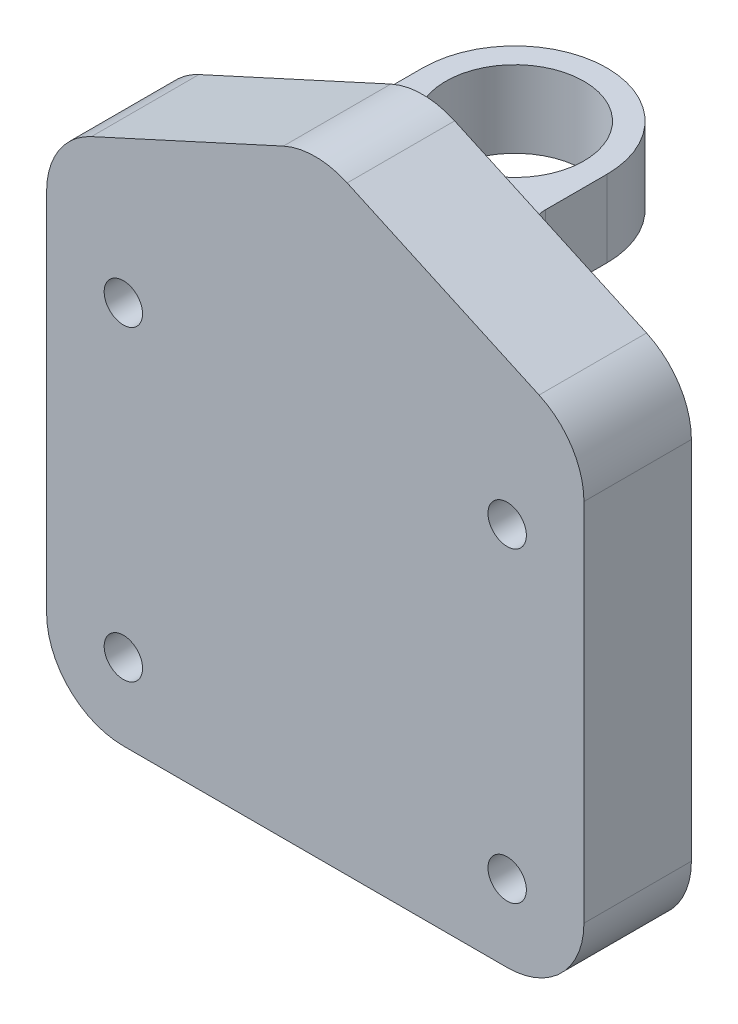
ISO-10303-21;
HEADER;
FILE_DESCRIPTION(('STEP AP214'),'2;1');
FILE_NAME('part.step','',(''),(''),'','','');
FILE_SCHEMA(('AUTOMOTIVE_DESIGN { 1 0 10303 214 1 1 1 1 }'));
ENDSEC;
DATA;
#1=APPLICATION_CONTEXT('core data for automotive mechanical design processes');
#2=APPLICATION_PROTOCOL_DEFINITION('international standard','automotive_design',2000,#1);
#3=PRODUCT_CONTEXT('',#1,'mechanical');
#4=PRODUCT('Part','Part','',(#3));
#5=PRODUCT_RELATED_PRODUCT_CATEGORY('part','',(#4));
#6=PRODUCT_DEFINITION_FORMATION('','',#4);
#7=PRODUCT_DEFINITION_CONTEXT('part definition',#1,'design');
#8=PRODUCT_DEFINITION('design','',#6,#7);
#9=PRODUCT_DEFINITION_SHAPE('','',#8);
#10=(LENGTH_UNIT() NAMED_UNIT(*) SI_UNIT(.MILLI.,.METRE.));
#11=(NAMED_UNIT(*) PLANE_ANGLE_UNIT() SI_UNIT($,.RADIAN.));
#12=(NAMED_UNIT(*) SI_UNIT($,.STERADIAN.) SOLID_ANGLE_UNIT());
#13=UNCERTAINTY_MEASURE_WITH_UNIT(LENGTH_MEASURE(1.E-05),#10,'distance_accuracy_value','');
#14=(GEOMETRIC_REPRESENTATION_CONTEXT(3) GLOBAL_UNCERTAINTY_ASSIGNED_CONTEXT((#13)) GLOBAL_UNIT_ASSIGNED_CONTEXT((#10,
#11,#12)) REPRESENTATION_CONTEXT('',''));
#15=CARTESIAN_POINT('',(0.,0.,0.));
#16=DIRECTION('',(0.,0.,1.));
#17=DIRECTION('',(1.,0.,0.));
#18=AXIS2_PLACEMENT_3D('',#15,#16,#17);
#19=CARTESIAN_POINT('',(0.,-9.05756915921913E-12,217.634763614724));
#20=DIRECTION('',(0.,0.,-1.));
#21=DIRECTION('',(0.,1.,0.));
#22=AXIS2_PLACEMENT_3D('',#19,#20,#21);
#23=PLANE('',#22);
#24=CARTESIAN_POINT('',(12.5000000000011,-685.255568978379,217.634763614696));
#25=DIRECTION('',(0.,0.,-1.));
#26=DIRECTION('',(0.,1.,0.));
#27=AXIS2_PLACEMENT_3D('',#24,#25,#26);
#28=CIRCLE('',#27,1.25000000000002);
#29=CARTESIAN_POINT('',(12.5000000000011,-684.005568978379,217.634763614696));
#30=VERTEX_POINT('',#29);
#31=EDGE_CURVE('E261',#30,#30,#28,.T.);
#32=ORIENTED_EDGE('',*,*,#31,.F.);
#33=EDGE_LOOP('',(#32));
#34=FACE_BOUND('',#33,.T.);
#35=CARTESIAN_POINT('',(-12.499999999999,-665.255568978379,217.634763614697));
#36=DIRECTION('',(0.,0.,-1.));
#37=DIRECTION('',(0.,1.,0.));
#38=AXIS2_PLACEMENT_3D('',#35,#36,#37);
#39=CIRCLE('',#38,1.25000000000002);
#40=CARTESIAN_POINT('',(-12.499999999999,-664.005568978379,217.634763614697));
#41=VERTEX_POINT('',#40);
#42=EDGE_CURVE('E273',#41,#41,#39,.T.);
#43=ORIENTED_EDGE('',*,*,#42,.F.);
#44=EDGE_LOOP('',(#43));
#45=FACE_BOUND('',#44,.T.);
#46=CARTESIAN_POINT('',(12.500000000001,-665.255568978379,217.634763614697));
#47=DIRECTION('',(0.,0.,-1.));
#48=DIRECTION('',(0.,1.,0.));
#49=AXIS2_PLACEMENT_3D('',#46,#47,#48);
#50=CIRCLE('',#49,1.25000000000002);
#51=CARTESIAN_POINT('',(12.500000000001,-664.005568978379,217.634763614697));
#52=VERTEX_POINT('',#51);
#53=EDGE_CURVE('E267',#52,#52,#50,.T.);
#54=ORIENTED_EDGE('',*,*,#53,.F.);
#55=EDGE_LOOP('',(#54));
#56=FACE_BOUND('',#55,.T.);
#57=CARTESIAN_POINT('',(-12.4999999999989,-685.255568978379,217.634763614696));
#58=DIRECTION('',(0.,0.,-1.));
#59=DIRECTION('',(0.,1.,0.));
#60=AXIS2_PLACEMENT_3D('',#57,#58,#59);
#61=CIRCLE('',#60,1.24999999999999);
#62=CARTESIAN_POINT('',(-12.4999999999989,-684.005568978379,217.634763614696));
#63=VERTEX_POINT('',#62);
#64=EDGE_CURVE('E255',#63,#63,#61,.T.);
#65=ORIENTED_EDGE('',*,*,#64,.F.);
#66=EDGE_LOOP('',(#65));
#67=FACE_BOUND('',#66,.T.);
#68=DIRECTION('',(-1.,0.,0.));
#69=VECTOR('',#68,1.);
#70=CARTESIAN_POINT('',(6.00000000000137,-655.255568978379,217.634763614697));
#71=LINE('',#70,#69);
#72=CARTESIAN_POINT('',(8.00000000000138,-655.255568978379,217.634763614697));
#73=VERTEX_POINT('',#72);
#74=CARTESIAN_POINT('',(-7.99999999999862,-655.255568978379,217.634763614697));
#75=VERTEX_POINT('',#74);
#76=EDGE_CURVE('E244',#73,#75,#71,.T.);
#77=ORIENTED_EDGE('',*,*,#76,.T.);
#78=DIRECTION('',(0.,1.,0.));
#79=VECTOR('',#78,1.);
#80=CARTESIAN_POINT('',(-8.0000000000007,-9.08294568549627E-12,217.634763614724));
#81=LINE('',#80,#79);
#82=CARTESIAN_POINT('',(-7.99999999999861,-660.255568978379,217.634763614697));
#83=VERTEX_POINT('',#82);
#84=EDGE_CURVE('E315',#75,#83,#81,.F.);
#85=ORIENTED_EDGE('',*,*,#84,.T.);
#86=DIRECTION('',(-1.,0.,0.));
#87=VECTOR('',#86,1.);
#88=CARTESIAN_POINT('',(6.00000000000138,-660.255568978379,217.634763614697));
#89=LINE('',#88,#87);
#90=CARTESIAN_POINT('',(8.00000000000139,-660.255568978379,217.634763614697));
#91=VERTEX_POINT('',#90);
#92=EDGE_CURVE('E234',#91,#83,#89,.T.);
#93=ORIENTED_EDGE('',*,*,#92,.F.);
#94=DIRECTION('',(0.,1.,0.));
#95=VECTOR('',#94,1.);
#96=CARTESIAN_POINT('',(7.9999999999993,-9.03219263294198E-12,217.634763614724));
#97=LINE('',#96,#95);
#98=EDGE_CURVE('E312',#91,#73,#97,.T.);
#99=ORIENTED_EDGE('',*,*,#98,.T.);
#100=EDGE_LOOP('',(#77,#85,#93,#99));
#101=FACE_BOUND('',#100,.T.);
#102=DIRECTION('',(-1.,0.,0.));
#103=VECTOR('',#102,1.);
#104=CARTESIAN_POINT('',(17.5000000000011,-690.255568978379,217.634763614696));
#105=LINE('',#104,#103);
#106=CARTESIAN_POINT('',(-7.99999999999851,-690.255568978379,217.634763614696));
#107=VERTEX_POINT('',#106);
#108=CARTESIAN_POINT('',(-12.4999999999989,-690.255568978379,217.634763614696));
#109=VERTEX_POINT('',#108);
#110=EDGE_CURVE('E282',#107,#109,#105,.T.);
#111=ORIENTED_EDGE('',*,*,#110,.T.);
#112=CARTESIAN_POINT('',(-12.4999999999989,-685.255568978379,217.634763614696));
#113=DIRECTION('',(0.,0.,-1.));
#114=DIRECTION('',(0.,1.,0.));
#115=AXIS2_PLACEMENT_3D('',#112,#113,#114);
#116=CIRCLE('',#115,5.);
#117=CARTESIAN_POINT('',(-17.4999999999989,-685.255568978379,217.634763614696));
#118=VERTEX_POINT('',#117);
#119=EDGE_CURVE('E370',#109,#118,#116,.T.);
#120=ORIENTED_EDGE('',*,*,#119,.T.);
#121=DIRECTION('',(0.,1.,0.));
#122=VECTOR('',#121,1.);
#123=CARTESIAN_POINT('',(-17.4999999999989,-690.255568978379,217.634763614696));
#124=LINE('',#123,#122);
#125=CARTESIAN_POINT('',(-17.499999999999,-661.467535094063,217.634763614697));
#126=VERTEX_POINT('',#125);
#127=EDGE_CURVE('E281',#118,#126,#124,.T.);
#128=ORIENTED_EDGE('',*,*,#127,.T.);
#129=CARTESIAN_POINT('',(-12.499999999999,-661.467535094063,217.634763614697));
#130=DIRECTION('',(0.,0.,-1.));
#131=DIRECTION('',(0.,1.,0.));
#132=AXIS2_PLACEMENT_3D('',#129,#130,#131);
#133=CIRCLE('',#132,5.);
#134=CARTESIAN_POINT('',(-14.5787988013381,-656.920162716134,217.634763614697));
#135=VERTEX_POINT('',#134);
#136=EDGE_CURVE('E363',#126,#135,#133,.T.);
#137=ORIENTED_EDGE('',*,*,#136,.T.);
#138=DIRECTION('',(0.9094744755858,0.415759760267795,0.));
#139=VECTOR('',#138,1.);
#140=CARTESIAN_POINT('',(9.16097855664178E-13,-650.255568978379,217.634763614697));
#141=LINE('',#140,#139);
#142=CARTESIAN_POINT('',(-2.07879880133798,-651.205877001848,217.634763614697));
#143=VERTEX_POINT('',#142);
#144=EDGE_CURVE('E285',#135,#143,#141,.T.);
#145=ORIENTED_EDGE('',*,*,#144,.T.);
#146=CARTESIAN_POINT('',(9.47159017883337E-13,-655.753249379777,217.634763614697));
#147=DIRECTION('',(0.,0.,-1.));
#148=DIRECTION('',(0.,1.,0.));
#149=AXIS2_PLACEMENT_3D('',#146,#147,#148);
#150=CIRCLE('',#149,5.);
#151=CARTESIAN_POINT('',(2.07879880133987,-651.205877001848,217.634763614697));
#152=VERTEX_POINT('',#151);
#153=EDGE_CURVE('E365',#143,#152,#150,.T.);
#154=ORIENTED_EDGE('',*,*,#153,.T.);
#155=DIRECTION('',(0.909474475585802,-0.415759760267789,0.));
#156=VECTOR('',#155,1.);
#157=CARTESIAN_POINT('',(17.5000000000009,-658.255568978379,217.634763614697));
#158=LINE('',#157,#156);
#159=CARTESIAN_POINT('',(14.5787988013399,-656.920162716134,217.634763614697));
#160=VERTEX_POINT('',#159);
#161=EDGE_CURVE('E288',#152,#160,#158,.T.);
#162=ORIENTED_EDGE('',*,*,#161,.T.);
#163=CARTESIAN_POINT('',(12.500000000001,-661.467535094063,217.634763614697));
#164=DIRECTION('',(0.,0.,-1.));
#165=DIRECTION('',(0.,1.,0.));
#166=AXIS2_PLACEMENT_3D('',#163,#164,#165);
#167=CIRCLE('',#166,5.);
#168=CARTESIAN_POINT('',(17.500000000001,-661.467535094063,217.634763614697));
#169=VERTEX_POINT('',#168);
#170=EDGE_CURVE('E55',#160,#169,#167,.T.);
#171=ORIENTED_EDGE('',*,*,#170,.T.);
#172=DIRECTION('',(0.,-1.,0.));
#173=VECTOR('',#172,1.);
#174=CARTESIAN_POINT('',(17.5000000000011,-690.255568978379,217.634763614696));
#175=LINE('',#174,#173);
#176=CARTESIAN_POINT('',(17.500000000001,-685.255568978379,217.634763614696));
#177=VERTEX_POINT('',#176);
#178=EDGE_CURVE('E290',#169,#177,#175,.T.);
#179=ORIENTED_EDGE('',*,*,#178,.T.);
#180=CARTESIAN_POINT('',(12.500000000001,-685.255568978379,217.634763614696));
#181=DIRECTION('',(0.,0.,-1.));
#182=DIRECTION('',(0.,1.,0.));
#183=AXIS2_PLACEMENT_3D('',#180,#181,#182);
#184=CIRCLE('',#183,5.);
#185=CARTESIAN_POINT('',(12.5000000000011,-690.255568978379,217.634763614696));
#186=VERTEX_POINT('',#185);
#187=EDGE_CURVE('E368',#177,#186,#184,.T.);
#188=ORIENTED_EDGE('',*,*,#187,.T.);
#189=CARTESIAN_POINT('',(8.00000000000149,-690.255568978379,217.634763614696));
#190=VERTEX_POINT('',#189);
#191=EDGE_CURVE('E279',#186,#190,#105,.T.);
#192=ORIENTED_EDGE('',*,*,#191,.T.);
#193=DIRECTION('',(0.,1.,0.));
#194=VECTOR('',#193,1.);
#195=CARTESIAN_POINT('',(7.9999999999993,-9.03219263294198E-12,217.634763614724));
#196=LINE('',#195,#194);
#197=CARTESIAN_POINT('',(8.00000000000147,-685.255568978379,217.634763614696));
#198=VERTEX_POINT('',#197);
#199=EDGE_CURVE('E309',#190,#198,#196,.T.);
#200=ORIENTED_EDGE('',*,*,#199,.T.);
#201=DIRECTION('',(-1.,0.,0.));
#202=VECTOR('',#201,1.);
#203=CARTESIAN_POINT('',(6.00000000000146,-685.255568978379,217.634763614696));
#204=LINE('',#203,#202);
#205=CARTESIAN_POINT('',(-7.99999999999853,-685.255568978379,217.634763614696));
#206=VERTEX_POINT('',#205);
#207=EDGE_CURVE('E219',#198,#206,#204,.T.);
#208=ORIENTED_EDGE('',*,*,#207,.T.);
#209=DIRECTION('',(0.,1.,0.));
#210=VECTOR('',#209,1.);
#211=CARTESIAN_POINT('',(-8.0000000000007,-9.08294568549627E-12,217.634763614724));
#212=LINE('',#211,#210);
#213=EDGE_CURVE('E307',#206,#107,#212,.F.);
#214=ORIENTED_EDGE('',*,*,#213,.T.);
#215=EDGE_LOOP('',(#111,#120,#128,#137,#145,#154,#162,#171,#179,#188,#192,#200,#208,#214));
#216=FACE_BOUND('',#215,.T.);
#217=ADVANCED_FACE('F33',(#34,#45,#56,#67,#101,#216),#23,.T.);
#218=CARTESIAN_POINT('',(0.,-9.3523007511111E-12,224.634763614724));
#219=DIRECTION('',(0.,0.,-1.));
#220=DIRECTION('',(0.,1.,0.));
#221=AXIS2_PLACEMENT_3D('',#218,#219,#220);
#222=PLANE('',#221);
#223=DIRECTION('',(0.,1.,0.));
#224=VECTOR('',#223,1.);
#225=CARTESIAN_POINT('',(-17.4999999999989,-690.255568978379,224.634763614696));
#226=LINE('',#225,#224);
#227=CARTESIAN_POINT('',(-17.4999999999989,-685.255568978379,224.634763614696));
#228=VERTEX_POINT('',#227);
#229=CARTESIAN_POINT('',(-17.499999999999,-661.467535094063,224.634763614697));
#230=VERTEX_POINT('',#229);
#231=EDGE_CURVE('E294',#228,#230,#226,.T.);
#232=ORIENTED_EDGE('',*,*,#231,.F.);
#233=CARTESIAN_POINT('',(-12.4999999999989,-685.255568978379,224.634763614696));
#234=DIRECTION('',(0.,0.,-1.));
#235=DIRECTION('',(0.,1.,0.));
#236=AXIS2_PLACEMENT_3D('',#233,#234,#235);
#237=CIRCLE('',#236,5.);
#238=CARTESIAN_POINT('',(-12.4999999999989,-690.255568978379,224.634763614696));
#239=VERTEX_POINT('',#238);
#240=EDGE_CURVE('E356',#228,#239,#237,.F.);
#241=ORIENTED_EDGE('',*,*,#240,.T.);
#242=DIRECTION('',(-1.,0.,0.));
#243=VECTOR('',#242,1.);
#244=CARTESIAN_POINT('',(17.5000000000011,-690.255568978379,224.634763614696));
#245=LINE('',#244,#243);
#246=CARTESIAN_POINT('',(12.5000000000011,-690.255568978379,224.634763614696));
#247=VERTEX_POINT('',#246);
#248=EDGE_CURVE('E276',#247,#239,#245,.T.);
#249=ORIENTED_EDGE('',*,*,#248,.F.);
#250=CARTESIAN_POINT('',(12.500000000001,-685.255568978379,224.634763614696));
#251=DIRECTION('',(0.,0.,-1.));
#252=DIRECTION('',(0.,1.,0.));
#253=AXIS2_PLACEMENT_3D('',#250,#251,#252);
#254=CIRCLE('',#253,5.);
#255=CARTESIAN_POINT('',(17.500000000001,-685.255568978379,224.634763614696));
#256=VERTEX_POINT('',#255);
#257=EDGE_CURVE('E354',#247,#256,#254,.F.);
#258=ORIENTED_EDGE('',*,*,#257,.T.);
#259=DIRECTION('',(0.,-1.,0.));
#260=VECTOR('',#259,1.);
#261=CARTESIAN_POINT('',(17.5000000000011,-690.255568978379,224.634763614696));
#262=LINE('',#261,#260);
#263=CARTESIAN_POINT('',(17.500000000001,-661.467535094063,224.634763614697));
#264=VERTEX_POINT('',#263);
#265=EDGE_CURVE('E303',#264,#256,#262,.T.);
#266=ORIENTED_EDGE('',*,*,#265,.F.);
#267=CARTESIAN_POINT('',(12.500000000001,-661.467535094063,224.634763614697));
#268=DIRECTION('',(0.,0.,-1.));
#269=DIRECTION('',(0.,1.,0.));
#270=AXIS2_PLACEMENT_3D('',#267,#268,#269);
#271=CIRCLE('',#270,5.);
#272=CARTESIAN_POINT('',(14.5787988013399,-656.920162716134,224.634763614697));
#273=VERTEX_POINT('',#272);
#274=EDGE_CURVE('E352',#264,#273,#271,.F.);
#275=ORIENTED_EDGE('',*,*,#274,.T.);
#276=DIRECTION('',(0.909474475585802,-0.415759760267789,0.));
#277=VECTOR('',#276,1.);
#278=CARTESIAN_POINT('',(17.5000000000009,-658.255568978379,224.634763614697));
#279=LINE('',#278,#277);
#280=CARTESIAN_POINT('',(2.07879880133987,-651.205877001848,224.634763614697));
#281=VERTEX_POINT('',#280);
#282=EDGE_CURVE('E300',#281,#273,#279,.T.);
#283=ORIENTED_EDGE('',*,*,#282,.F.);
#284=CARTESIAN_POINT('',(9.46576150795408E-13,-655.753249379777,224.634763614697));
#285=DIRECTION('',(0.,0.,-1.));
#286=DIRECTION('',(0.,1.,0.));
#287=AXIS2_PLACEMENT_3D('',#284,#285,#286);
#288=CIRCLE('',#287,5.);
#289=CARTESIAN_POINT('',(-2.07879880133798,-651.205877001848,224.634763614697));
#290=VERTEX_POINT('',#289);
#291=EDGE_CURVE('E350',#281,#290,#288,.F.);
#292=ORIENTED_EDGE('',*,*,#291,.T.);
#293=DIRECTION('',(0.9094744755858,0.415759760267795,0.));
#294=VECTOR('',#293,1.);
#295=CARTESIAN_POINT('',(9.1551498857625E-13,-650.255568978379,224.634763614697));
#296=LINE('',#295,#294);
#297=CARTESIAN_POINT('',(-14.5787988013381,-656.920162716134,224.634763614697));
#298=VERTEX_POINT('',#297);
#299=EDGE_CURVE('E297',#298,#290,#296,.T.);
#300=ORIENTED_EDGE('',*,*,#299,.F.);
#301=CARTESIAN_POINT('',(-12.499999999999,-661.467535094063,224.634763614697));
#302=DIRECTION('',(0.,0.,-1.));
#303=DIRECTION('',(0.,1.,0.));
#304=AXIS2_PLACEMENT_3D('',#301,#302,#303);
#305=CIRCLE('',#304,5.);
#306=EDGE_CURVE('E348',#298,#230,#305,.F.);
#307=ORIENTED_EDGE('',*,*,#306,.T.);
#308=EDGE_LOOP('',(#232,#241,#249,#258,#266,#275,#283,#292,#300,#307));
#309=FACE_BOUND('',#308,.T.);
#310=CARTESIAN_POINT('',(-12.499999999999,-665.255568978379,224.634763614697));
#311=DIRECTION('',(0.,0.,-1.));
#312=DIRECTION('',(0.,1.,0.));
#313=AXIS2_PLACEMENT_3D('',#310,#311,#312);
#314=CIRCLE('',#313,1.25000000000002);
#315=CARTESIAN_POINT('',(-12.499999999999,-664.005568978379,224.634763614697));
#316=VERTEX_POINT('',#315);
#317=EDGE_CURVE('E270',#316,#316,#314,.T.);
#318=ORIENTED_EDGE('',*,*,#317,.T.);
#319=EDGE_LOOP('',(#318));
#320=FACE_BOUND('',#319,.T.);
#321=CARTESIAN_POINT('',(12.500000000001,-665.255568978379,224.634763614697));
#322=DIRECTION('',(0.,0.,-1.));
#323=DIRECTION('',(0.,1.,0.));
#324=AXIS2_PLACEMENT_3D('',#321,#322,#323);
#325=CIRCLE('',#324,1.25000000000002);
#326=CARTESIAN_POINT('',(12.500000000001,-664.005568978379,224.634763614697));
#327=VERTEX_POINT('',#326);
#328=EDGE_CURVE('E264',#327,#327,#325,.T.);
#329=ORIENTED_EDGE('',*,*,#328,.T.);
#330=EDGE_LOOP('',(#329));
#331=FACE_BOUND('',#330,.T.);
#332=CARTESIAN_POINT('',(12.5000000000011,-685.255568978379,224.634763614696));
#333=DIRECTION('',(0.,0.,-1.));
#334=DIRECTION('',(0.,1.,0.));
#335=AXIS2_PLACEMENT_3D('',#332,#333,#334);
#336=CIRCLE('',#335,1.25000000000002);
#337=CARTESIAN_POINT('',(12.5000000000011,-684.005568978379,224.634763614696));
#338=VERTEX_POINT('',#337);
#339=EDGE_CURVE('E258',#338,#338,#336,.T.);
#340=ORIENTED_EDGE('',*,*,#339,.T.);
#341=EDGE_LOOP('',(#340));
#342=FACE_BOUND('',#341,.T.);
#343=CARTESIAN_POINT('',(-12.4999999999989,-685.255568978379,224.634763614696));
#344=DIRECTION('',(0.,0.,-1.));
#345=DIRECTION('',(0.,1.,0.));
#346=AXIS2_PLACEMENT_3D('',#343,#344,#345);
#347=CIRCLE('',#346,1.24999999999999);
#348=CARTESIAN_POINT('',(-12.4999999999989,-684.005568978379,224.634763614696));
#349=VERTEX_POINT('',#348);
#350=EDGE_CURVE('E254',#349,#349,#347,.T.);
#351=ORIENTED_EDGE('',*,*,#350,.T.);
#352=EDGE_LOOP('',(#351));
#353=FACE_BOUND('',#352,.T.);
#354=ADVANCED_FACE('F391',(#309,#320,#331,#342,#353),#222,.F.);
#355=CARTESIAN_POINT('',(17.5000000000011,-690.255568978379,217.634763614696));
#356=DIRECTION('',(0.,1.,0.));
#357=DIRECTION('',(0.,0.,1.));
#358=AXIS2_PLACEMENT_3D('',#355,#356,#357);
#359=PLANE('',#358);
#360=ORIENTED_EDGE('',*,*,#248,.T.);
#361=DIRECTION('',(0.,0.,1.));
#362=VECTOR('',#361,1.);
#363=CARTESIAN_POINT('',(-12.4999999999989,-690.255568978379,217.634763614696));
#364=LINE('',#363,#362);
#365=EDGE_CURVE('E361',#239,#109,#364,.F.);
#366=ORIENTED_EDGE('',*,*,#365,.T.);
#367=ORIENTED_EDGE('',*,*,#110,.F.);
#368=CARTESIAN_POINT('',(-7.99999999999851,-690.255568978379,215.634763614696));
#369=DIRECTION('',(0.,1.,0.));
#370=DIRECTION('',(0.,0.,1.));
#371=AXIS2_PLACEMENT_3D('',#368,#369,#370);
#372=CIRCLE('',#371,2.);
#373=CARTESIAN_POINT('',(-5.99999999999851,-690.255568978379,215.634763614696));
#374=VERTEX_POINT('',#373);
#375=EDGE_CURVE('E193',#107,#374,#372,.T.);
#376=ORIENTED_EDGE('',*,*,#375,.T.);
#377=DIRECTION('',(0.,0.,-1.));
#378=VECTOR('',#377,1.);
#379=CARTESIAN_POINT('',(-5.99999999999852,-690.255568978379,217.634763614695));
#380=LINE('',#379,#378);
#381=CARTESIAN_POINT('',(-5.9999999999985,-690.255568978378,211.634763614695));
#382=VERTEX_POINT('',#381);
#383=EDGE_CURVE('E182',#374,#382,#380,.T.);
#384=ORIENTED_EDGE('',*,*,#383,.T.);
#385=CARTESIAN_POINT('',(1.50452658409718E-12,-690.255568978378,211.634763614695));
#386=DIRECTION('',(0.,-1.,0.));
#387=DIRECTION('',(0.,0.,-1.));
#388=AXIS2_PLACEMENT_3D('',#385,#386,#387);
#389=CIRCLE('',#388,6.);
#390=CARTESIAN_POINT('',(6.00000000000151,-690.255568978378,211.634763614696));
#391=VERTEX_POINT('',#390);
#392=EDGE_CURVE('E189',#382,#391,#389,.T.);
#393=ORIENTED_EDGE('',*,*,#392,.T.);
#394=DIRECTION('',(0.,0.,1.));
#395=VECTOR('',#394,1.);
#396=CARTESIAN_POINT('',(6.00000000000151,-690.255568978378,211.634763614696));
#397=LINE('',#396,#395);
#398=CARTESIAN_POINT('',(6.00000000000149,-690.255568978379,215.634763614696));
#399=VERTEX_POINT('',#398);
#400=EDGE_CURVE('E197',#391,#399,#397,.T.);
#401=ORIENTED_EDGE('',*,*,#400,.T.);
#402=CARTESIAN_POINT('',(8.00000000000149,-690.255568978379,215.634763614696));
#403=DIRECTION('',(0.,1.,0.));
#404=DIRECTION('',(0.,0.,1.));
#405=AXIS2_PLACEMENT_3D('',#402,#403,#404);
#406=CIRCLE('',#405,2.);
#407=EDGE_CURVE('E336',#399,#190,#406,.T.);
#408=ORIENTED_EDGE('',*,*,#407,.T.);
#409=ORIENTED_EDGE('',*,*,#191,.F.);
#410=DIRECTION('',(0.,0.,1.));
#411=VECTOR('',#410,1.);
#412=CARTESIAN_POINT('',(12.5000000000011,-690.255568978379,217.634763614696));
#413=LINE('',#412,#411);
#414=EDGE_CURVE('E358',#186,#247,#413,.T.);
#415=ORIENTED_EDGE('',*,*,#414,.T.);
#416=EDGE_LOOP('',(#360,#366,#367,#376,#384,#393,#401,#408,#409,#415));
#417=FACE_BOUND('',#416,.T.);
#418=CARTESIAN_POINT('',(1.50452658409718E-12,-690.255568978378,211.634763614695));
#419=DIRECTION('',(0.,-1.,0.));
#420=DIRECTION('',(0.,0.,-1.));
#421=AXIS2_PLACEMENT_3D('',#418,#419,#420);
#422=CIRCLE('',#421,4.49999999999999);
#423=CARTESIAN_POINT('',(1.50452658409718E-12,-690.255568978378,207.134763614695));
#424=VERTEX_POINT('',#423);
#425=EDGE_CURVE('E220',#424,#424,#422,.T.);
#426=ORIENTED_EDGE('',*,*,#425,.F.);
#427=EDGE_LOOP('',(#426));
#428=FACE_BOUND('',#427,.T.);
#429=ADVANCED_FACE('F185',(#417,#428),#359,.F.);
#430=CARTESIAN_POINT('',(-17.4999999999989,-690.255568978379,217.634763614696));
#431=DIRECTION('',(1.,0.,0.));
#432=DIRECTION('',(0.,1.,0.));
#433=AXIS2_PLACEMENT_3D('',#430,#431,#432);
#434=PLANE('',#433);
#435=ORIENTED_EDGE('',*,*,#127,.F.);
#436=DIRECTION('',(0.,0.,1.));
#437=VECTOR('',#436,1.);
#438=CARTESIAN_POINT('',(-17.4999999999989,-685.255568978379,217.634763614696));
#439=LINE('',#438,#437);
#440=EDGE_CURVE('E345',#118,#228,#439,.T.);
#441=ORIENTED_EDGE('',*,*,#440,.T.);
#442=ORIENTED_EDGE('',*,*,#231,.T.);
#443=DIRECTION('',(0.,0.,1.));
#444=VECTOR('',#443,1.);
#445=CARTESIAN_POINT('',(-17.499999999999,-661.467535094063,217.634763614697));
#446=LINE('',#445,#444);
#447=EDGE_CURVE('E343',#230,#126,#446,.F.);
#448=ORIENTED_EDGE('',*,*,#447,.T.);
#449=EDGE_LOOP('',(#435,#441,#442,#448));
#450=FACE_BOUND('',#449,.T.);
#451=ADVANCED_FACE('F437',(#450),#434,.F.);
#452=CARTESIAN_POINT('',(9.16097855664178E-13,-650.255568978379,217.634763614697));
#453=DIRECTION('',(0.415759760267795,-0.9094744755858,0.));
#454=DIRECTION('',(0.9094744755858,0.415759760267795,0.));
#455=AXIS2_PLACEMENT_3D('',#452,#453,#454);
#456=PLANE('',#455);
#457=ORIENTED_EDGE('',*,*,#299,.T.);
#458=DIRECTION('',(0.,0.,1.));
#459=VECTOR('',#458,1.);
#460=CARTESIAN_POINT('',(-2.078798801338,-651.205877001848,217.634763614697));
#461=LINE('',#460,#459);
#462=EDGE_CURVE('E11',#290,#143,#461,.F.);
#463=ORIENTED_EDGE('',*,*,#462,.T.);
#464=ORIENTED_EDGE('',*,*,#144,.F.);
#465=DIRECTION('',(0.,0.,1.));
#466=VECTOR('',#465,1.);
#467=CARTESIAN_POINT('',(-14.5787988013381,-656.920162716134,217.634763614697));
#468=LINE('',#467,#466);
#469=EDGE_CURVE('E41',#135,#298,#468,.T.);
#470=ORIENTED_EDGE('',*,*,#469,.T.);
#471=EDGE_LOOP('',(#457,#463,#464,#470));
#472=FACE_BOUND('',#471,.T.);
#473=ADVANCED_FACE('F385',(#472),#456,.F.);
#474=CARTESIAN_POINT('',(17.5000000000009,-658.255568978379,217.634763614697));
#475=DIRECTION('',(-0.415759760267789,-0.909474475585802,0.));
#476=DIRECTION('',(0.909474475585803,-0.415759760267789,0.));
#477=AXIS2_PLACEMENT_3D('',#474,#475,#476);
#478=PLANE('',#477);
#479=ORIENTED_EDGE('',*,*,#282,.T.);
#480=DIRECTION('',(0.,0.,1.));
#481=VECTOR('',#480,1.);
#482=CARTESIAN_POINT('',(14.5787988013399,-656.920162716134,217.634763614697));
#483=LINE('',#482,#481);
#484=EDGE_CURVE('E379',#273,#160,#483,.F.);
#485=ORIENTED_EDGE('',*,*,#484,.T.);
#486=ORIENTED_EDGE('',*,*,#161,.F.);
#487=DIRECTION('',(0.,0.,1.));
#488=VECTOR('',#487,1.);
#489=CARTESIAN_POINT('',(2.07879880133989,-651.205877001848,217.634763614697));
#490=LINE('',#489,#488);
#491=EDGE_CURVE('E376',#152,#281,#490,.T.);
#492=ORIENTED_EDGE('',*,*,#491,.T.);
#493=EDGE_LOOP('',(#479,#485,#486,#492));
#494=FACE_BOUND('',#493,.T.);
#495=ADVANCED_FACE('F400',(#494),#478,.F.);
#496=CARTESIAN_POINT('',(17.5000000000011,-690.255568978379,217.634763614696));
#497=DIRECTION('',(-1.,0.,0.));
#498=DIRECTION('',(0.,-1.,0.));
#499=AXIS2_PLACEMENT_3D('',#496,#497,#498);
#500=PLANE('',#499);
#501=ORIENTED_EDGE('',*,*,#265,.T.);
#502=DIRECTION('',(0.,0.,1.));
#503=VECTOR('',#502,1.);
#504=CARTESIAN_POINT('',(17.500000000001,-685.255568978379,217.634763614696));
#505=LINE('',#504,#503);
#506=EDGE_CURVE('E48',#256,#177,#505,.F.);
#507=ORIENTED_EDGE('',*,*,#506,.T.);
#508=ORIENTED_EDGE('',*,*,#178,.F.);
#509=DIRECTION('',(0.,0.,1.));
#510=VECTOR('',#509,1.);
#511=CARTESIAN_POINT('',(17.500000000001,-661.467535094063,217.634763614697));
#512=LINE('',#511,#510);
#513=EDGE_CURVE('E372',#169,#264,#512,.T.);
#514=ORIENTED_EDGE('',*,*,#513,.T.);
#515=EDGE_LOOP('',(#501,#507,#508,#514));
#516=FACE_BOUND('',#515,.T.);
#517=ADVANCED_FACE('F407',(#516),#500,.F.);
#518=CARTESIAN_POINT('',(-12.499999999999,-665.255568978379,217.634763614697));
#519=DIRECTION('',(0.,0.,1.));
#520=DIRECTION('',(0.,-1.,0.));
#521=AXIS2_PLACEMENT_3D('',#518,#519,#520);
#522=CYLINDRICAL_SURFACE('',#521,1.25000000000002);
#523=ORIENTED_EDGE('',*,*,#42,.T.);
#524=EDGE_LOOP('',(#523));
#525=FACE_BOUND('',#524,.T.);
#526=ORIENTED_EDGE('',*,*,#317,.F.);
#527=EDGE_LOOP('',(#526));
#528=FACE_BOUND('',#527,.T.);
#529=ADVANCED_FACE('F455',(#525,#528),#522,.F.);
#530=CARTESIAN_POINT('',(12.500000000001,-665.255568978379,217.634763614697));
#531=DIRECTION('',(0.,0.,1.));
#532=DIRECTION('',(0.,-1.,0.));
#533=AXIS2_PLACEMENT_3D('',#530,#531,#532);
#534=CYLINDRICAL_SURFACE('',#533,1.25000000000002);
#535=ORIENTED_EDGE('',*,*,#53,.T.);
#536=EDGE_LOOP('',(#535));
#537=FACE_BOUND('',#536,.T.);
#538=ORIENTED_EDGE('',*,*,#328,.F.);
#539=EDGE_LOOP('',(#538));
#540=FACE_BOUND('',#539,.T.);
#541=ADVANCED_FACE('F482',(#537,#540),#534,.F.);
#542=CARTESIAN_POINT('',(12.5000000000011,-685.255568978379,217.634763614696));
#543=DIRECTION('',(0.,0.,1.));
#544=DIRECTION('',(0.,-1.,0.));
#545=AXIS2_PLACEMENT_3D('',#542,#543,#544);
#546=CYLINDRICAL_SURFACE('',#545,1.25000000000002);
#547=ORIENTED_EDGE('',*,*,#31,.T.);
#548=EDGE_LOOP('',(#547));
#549=FACE_BOUND('',#548,.T.);
#550=ORIENTED_EDGE('',*,*,#339,.F.);
#551=EDGE_LOOP('',(#550));
#552=FACE_BOUND('',#551,.T.);
#553=ADVANCED_FACE('F489',(#549,#552),#546,.F.);
#554=CARTESIAN_POINT('',(-12.4999999999989,-685.255568978379,217.634763614696));
#555=DIRECTION('',(0.,0.,1.));
#556=DIRECTION('',(0.,-1.,0.));
#557=AXIS2_PLACEMENT_3D('',#554,#555,#556);
#558=CYLINDRICAL_SURFACE('',#557,1.24999999999999);
#559=ORIENTED_EDGE('',*,*,#64,.T.);
#560=EDGE_LOOP('',(#559));
#561=FACE_BOUND('',#560,.T.);
#562=ORIENTED_EDGE('',*,*,#350,.F.);
#563=EDGE_LOOP('',(#562));
#564=FACE_BOUND('',#563,.T.);
#565=ADVANCED_FACE('F496',(#561,#564),#558,.F.);
#566=CARTESIAN_POINT('',(1.40936461055788E-12,-660.255568978378,211.634763614697));
#567=DIRECTION('',(0.,-1.,0.));
#568=DIRECTION('',(0.,0.,-1.));
#569=AXIS2_PLACEMENT_3D('',#566,#567,#568);
#570=PLANE('',#569);
#571=DIRECTION('',(0.,0.,1.));
#572=VECTOR('',#571,1.);
#573=CARTESIAN_POINT('',(6.00000000000138,-660.255568978379,217.634763614697));
#574=LINE('',#573,#572);
#575=CARTESIAN_POINT('',(6.00000000000141,-660.255568978378,211.634763614697));
#576=VERTEX_POINT('',#575);
#577=CARTESIAN_POINT('',(6.00000000000139,-660.255568978379,215.634763614697));
#578=VERTEX_POINT('',#577);
#579=EDGE_CURVE('E231',#576,#578,#574,.T.);
#580=ORIENTED_EDGE('',*,*,#579,.T.);
#581=CARTESIAN_POINT('',(8.00000000000139,-660.255568978379,215.634763614697));
#582=DIRECTION('',(0.,-1.,0.));
#583=DIRECTION('',(0.,0.,-1.));
#584=AXIS2_PLACEMENT_3D('',#581,#582,#583);
#585=CIRCLE('',#584,2.);
#586=EDGE_CURVE('E331',#578,#91,#585,.F.);
#587=ORIENTED_EDGE('',*,*,#586,.T.);
#588=ORIENTED_EDGE('',*,*,#92,.T.);
#589=CARTESIAN_POINT('',(-7.99999999999861,-660.255568978379,215.634763614697));
#590=DIRECTION('',(0.,-1.,0.));
#591=DIRECTION('',(0.,0.,-1.));
#592=AXIS2_PLACEMENT_3D('',#589,#590,#591);
#593=CIRCLE('',#592,2.);
#594=CARTESIAN_POINT('',(-5.99999999999861,-660.255568978379,215.634763614697));
#595=VERTEX_POINT('',#594);
#596=EDGE_CURVE('E327',#83,#595,#593,.F.);
#597=ORIENTED_EDGE('',*,*,#596,.T.);
#598=DIRECTION('',(0.,0.,-1.));
#599=VECTOR('',#598,1.);
#600=CARTESIAN_POINT('',(-5.99999999999862,-660.255568978379,217.634763614697));
#601=LINE('',#600,#599);
#602=CARTESIAN_POINT('',(-5.9999999999986,-660.255568978378,211.634763614697));
#603=VERTEX_POINT('',#602);
#604=EDGE_CURVE('E237',#595,#603,#601,.T.);
#605=ORIENTED_EDGE('',*,*,#604,.T.);
#606=CARTESIAN_POINT('',(1.40936461055788E-12,-660.255568978378,211.634763614697));
#607=DIRECTION('',(0.,-1.,0.));
#608=DIRECTION('',(0.,0.,-1.));
#609=AXIS2_PLACEMENT_3D('',#606,#607,#608);
#610=CIRCLE('',#609,6.);
#611=EDGE_CURVE('E239',#603,#576,#610,.T.);
#612=ORIENTED_EDGE('',*,*,#611,.T.);
#613=EDGE_LOOP('',(#580,#587,#588,#597,#605,#612));
#614=FACE_BOUND('',#613,.T.);
#615=CARTESIAN_POINT('',(1.40936461055788E-12,-660.255568978378,211.634763614697));
#616=DIRECTION('',(0.,-1.,0.));
#617=DIRECTION('',(0.,0.,-1.));
#618=AXIS2_PLACEMENT_3D('',#615,#616,#617);
#619=CIRCLE('',#618,4.49999999999999);
#620=CARTESIAN_POINT('',(1.40936461055788E-12,-660.255568978378,207.134763614697));
#621=VERTEX_POINT('',#620);
#622=EDGE_CURVE('E225',#621,#621,#619,.T.);
#623=ORIENTED_EDGE('',*,*,#622,.F.);
#624=EDGE_LOOP('',(#623));
#625=FACE_BOUND('',#624,.T.);
#626=ADVANCED_FACE('F504',(#614,#625),#570,.T.);
#627=CARTESIAN_POINT('',(1.39350428163466E-12,-655.255568978378,211.634763614697));
#628=DIRECTION('',(0.,-1.,0.));
#629=DIRECTION('',(0.,0.,-1.));
#630=AXIS2_PLACEMENT_3D('',#627,#628,#629);
#631=PLANE('',#630);
#632=DIRECTION('',(0.,0.,1.));
#633=VECTOR('',#632,1.);
#634=CARTESIAN_POINT('',(6.00000000000137,-655.255568978379,217.634763614697));
#635=LINE('',#634,#633);
#636=CARTESIAN_POINT('',(6.00000000000139,-655.255568978378,211.634763614697));
#637=VERTEX_POINT('',#636);
#638=CARTESIAN_POINT('',(6.00000000000137,-655.255568978378,215.634763614697));
#639=VERTEX_POINT('',#638);
#640=EDGE_CURVE('E228',#637,#639,#635,.T.);
#641=ORIENTED_EDGE('',*,*,#640,.F.);
#642=CARTESIAN_POINT('',(1.39350428163466E-12,-655.255568978378,211.634763614697));
#643=DIRECTION('',(0.,-1.,0.));
#644=DIRECTION('',(0.,0.,-1.));
#645=AXIS2_PLACEMENT_3D('',#642,#643,#644);
#646=CIRCLE('',#645,6.);
#647=CARTESIAN_POINT('',(-5.99999999999861,-655.255568978378,211.634763614697));
#648=VERTEX_POINT('',#647);
#649=EDGE_CURVE('E235',#648,#637,#646,.T.);
#650=ORIENTED_EDGE('',*,*,#649,.F.);
#651=DIRECTION('',(0.,0.,-1.));
#652=VECTOR('',#651,1.);
#653=CARTESIAN_POINT('',(-5.99999999999863,-655.255568978379,217.634763614697));
#654=LINE('',#653,#652);
#655=CARTESIAN_POINT('',(-5.99999999999863,-655.255568978379,215.634763614697));
#656=VERTEX_POINT('',#655);
#657=EDGE_CURVE('E246',#656,#648,#654,.T.);
#658=ORIENTED_EDGE('',*,*,#657,.F.);
#659=CARTESIAN_POINT('',(-7.99999999999862,-655.255568978379,215.634763614697));
#660=DIRECTION('',(0.,-1.,0.));
#661=DIRECTION('',(0.,0.,-1.));
#662=AXIS2_PLACEMENT_3D('',#659,#660,#661);
#663=CIRCLE('',#662,2.);
#664=EDGE_CURVE('E324',#656,#75,#663,.T.);
#665=ORIENTED_EDGE('',*,*,#664,.T.);
#666=ORIENTED_EDGE('',*,*,#76,.F.);
#667=CARTESIAN_POINT('',(8.00000000000138,-655.255568978379,215.634763614697));
#668=DIRECTION('',(0.,-1.,0.));
#669=DIRECTION('',(0.,0.,-1.));
#670=AXIS2_PLACEMENT_3D('',#667,#668,#669);
#671=CIRCLE('',#670,2.);
#672=EDGE_CURVE('E329',#73,#639,#671,.T.);
#673=ORIENTED_EDGE('',*,*,#672,.T.);
#674=EDGE_LOOP('',(#641,#650,#658,#665,#666,#673));
#675=FACE_BOUND('',#674,.T.);
#676=CARTESIAN_POINT('',(1.39350428163466E-12,-655.255568978378,211.634763614697));
#677=DIRECTION('',(0.,-1.,0.));
#678=DIRECTION('',(0.,0.,-1.));
#679=AXIS2_PLACEMENT_3D('',#676,#677,#678);
#680=CIRCLE('',#679,4.49999999999999);
#681=CARTESIAN_POINT('',(1.39350428163466E-12,-655.255568978378,207.134763614697));
#682=VERTEX_POINT('',#681);
#683=EDGE_CURVE('E206',#682,#682,#680,.T.);
#684=ORIENTED_EDGE('',*,*,#683,.T.);
#685=EDGE_LOOP('',(#684));
#686=FACE_BOUND('',#685,.T.);
#687=ADVANCED_FACE('F513',(#675,#686),#631,.F.);
#688=CARTESIAN_POINT('',(6.00000000000138,-660.255568978379,217.634763614697));
#689=DIRECTION('',(-1.,0.,0.));
#690=DIRECTION('',(0.,0.,1.));
#691=AXIS2_PLACEMENT_3D('',#688,#689,#690);
#692=PLANE('',#691);
#693=ORIENTED_EDGE('',*,*,#640,.T.);
#694=DIRECTION('',(0.,1.,0.));
#695=VECTOR('',#694,1.);
#696=CARTESIAN_POINT('',(6.00000000000139,-660.255568978379,215.634763614697));
#697=LINE('',#696,#695);
#698=EDGE_CURVE('E318',#639,#578,#697,.F.);
#699=ORIENTED_EDGE('',*,*,#698,.T.);
#700=ORIENTED_EDGE('',*,*,#579,.F.);
#701=DIRECTION('',(0.,1.,0.));
#702=VECTOR('',#701,1.);
#703=CARTESIAN_POINT('',(6.00000000000141,-660.255568978378,211.634763614697));
#704=LINE('',#703,#702);
#705=EDGE_CURVE('E241',#576,#637,#704,.T.);
#706=ORIENTED_EDGE('',*,*,#705,.T.);
#707=EDGE_LOOP('',(#693,#699,#700,#706));
#708=FACE_BOUND('',#707,.T.);
#709=ADVANCED_FACE('F522',(#708),#692,.F.);
#710=CARTESIAN_POINT('',(-5.99999999999862,-660.255568978379,217.634763614697));
#711=DIRECTION('',(1.,0.,0.));
#712=DIRECTION('',(0.,0.,-1.));
#713=AXIS2_PLACEMENT_3D('',#710,#711,#712);
#714=PLANE('',#713);
#715=ORIENTED_EDGE('',*,*,#604,.F.);
#716=DIRECTION('',(0.,1.,0.));
#717=VECTOR('',#716,1.);
#718=CARTESIAN_POINT('',(-5.99999999999861,-660.255568978379,215.634763614697));
#719=LINE('',#718,#717);
#720=EDGE_CURVE('E292',#595,#656,#719,.T.);
#721=ORIENTED_EDGE('',*,*,#720,.T.);
#722=ORIENTED_EDGE('',*,*,#657,.T.);
#723=DIRECTION('',(0.,1.,0.));
#724=VECTOR('',#723,1.);
#725=CARTESIAN_POINT('',(-5.9999999999986,-660.255568978378,211.634763614697));
#726=LINE('',#725,#724);
#727=EDGE_CURVE('E251',#603,#648,#726,.T.);
#728=ORIENTED_EDGE('',*,*,#727,.F.);
#729=EDGE_LOOP('',(#715,#721,#722,#728));
#730=FACE_BOUND('',#729,.T.);
#731=ADVANCED_FACE('F530',(#730),#714,.F.);
#732=CARTESIAN_POINT('',(1.40936461055788E-12,-660.255568978378,211.634763614697));
#733=DIRECTION('',(0.,1.,0.));
#734=DIRECTION('',(0.,0.,1.));
#735=AXIS2_PLACEMENT_3D('',#732,#733,#734);
#736=CYLINDRICAL_SURFACE('',#735,6.);
#737=ORIENTED_EDGE('',*,*,#649,.T.);
#738=ORIENTED_EDGE('',*,*,#705,.F.);
#739=ORIENTED_EDGE('',*,*,#611,.F.);
#740=ORIENTED_EDGE('',*,*,#727,.T.);
#741=EDGE_LOOP('',(#737,#738,#739,#740));
#742=FACE_BOUND('',#741,.T.);
#743=ADVANCED_FACE('F538',(#742),#736,.T.);
#744=CARTESIAN_POINT('',(1.40936461055788E-12,-660.255568978378,211.634763614697));
#745=DIRECTION('',(0.,1.,0.));
#746=DIRECTION('',(0.,0.,1.));
#747=AXIS2_PLACEMENT_3D('',#744,#745,#746);
#748=CYLINDRICAL_SURFACE('',#747,4.49999999999999);
#749=ORIENTED_EDGE('',*,*,#622,.T.);
#750=EDGE_LOOP('',(#749));
#751=FACE_BOUND('',#750,.T.);
#752=ORIENTED_EDGE('',*,*,#683,.F.);
#753=EDGE_LOOP('',(#752));
#754=FACE_BOUND('',#753,.T.);
#755=ADVANCED_FACE('F546',(#751,#754),#748,.F.);
#756=CARTESIAN_POINT('',(1.48866625517396E-12,-685.255568978378,211.634763614696));
#757=DIRECTION('',(0.,-1.,0.));
#758=DIRECTION('',(0.,0.,-1.));
#759=AXIS2_PLACEMENT_3D('',#756,#757,#758);
#760=PLANE('',#759);
#761=DIRECTION('',(0.,0.,1.));
#762=VECTOR('',#761,1.);
#763=CARTESIAN_POINT('',(6.00000000000149,-685.255568978378,211.634763614696));
#764=LINE('',#763,#762);
#765=CARTESIAN_POINT('',(6.00000000000149,-685.255568978378,211.634763614696));
#766=VERTEX_POINT('',#765);
#767=CARTESIAN_POINT('',(6.00000000000147,-685.255568978379,215.634763614696));
#768=VERTEX_POINT('',#767);
#769=EDGE_CURVE('E216',#766,#768,#764,.T.);
#770=ORIENTED_EDGE('',*,*,#769,.F.);
#771=CARTESIAN_POINT('',(1.48866625517396E-12,-685.255568978378,211.634763614696));
#772=DIRECTION('',(0.,-1.,0.));
#773=DIRECTION('',(0.,0.,-1.));
#774=AXIS2_PLACEMENT_3D('',#771,#772,#773);
#775=CIRCLE('',#774,6.);
#776=CARTESIAN_POINT('',(-5.99999999999852,-685.255568978378,211.634763614696));
#777=VERTEX_POINT('',#776);
#778=EDGE_CURVE('E223',#777,#766,#775,.T.);
#779=ORIENTED_EDGE('',*,*,#778,.F.);
#780=DIRECTION('',(0.,0.,-1.));
#781=VECTOR('',#780,1.);
#782=CARTESIAN_POINT('',(-5.99999999999854,-685.255568978379,217.634763614696));
#783=LINE('',#782,#781);
#784=CARTESIAN_POINT('',(-5.99999999999853,-685.255568978379,215.634763614696));
#785=VERTEX_POINT('',#784);
#786=EDGE_CURVE('E203',#785,#777,#783,.T.);
#787=ORIENTED_EDGE('',*,*,#786,.F.);
#788=CARTESIAN_POINT('',(-7.99999999999853,-685.255568978379,215.634763614696));
#789=DIRECTION('',(0.,-1.,0.));
#790=DIRECTION('',(0.,0.,-1.));
#791=AXIS2_PLACEMENT_3D('',#788,#789,#790);
#792=CIRCLE('',#791,2.);
#793=EDGE_CURVE('E339',#785,#206,#792,.T.);
#794=ORIENTED_EDGE('',*,*,#793,.T.);
#795=ORIENTED_EDGE('',*,*,#207,.F.);
#796=CARTESIAN_POINT('',(8.00000000000147,-685.255568978379,215.634763614696));
#797=DIRECTION('',(0.,-1.,0.));
#798=DIRECTION('',(0.,0.,-1.));
#799=AXIS2_PLACEMENT_3D('',#796,#797,#798);
#800=CIRCLE('',#799,2.);
#801=EDGE_CURVE('E334',#198,#768,#800,.T.);
#802=ORIENTED_EDGE('',*,*,#801,.T.);
#803=EDGE_LOOP('',(#770,#779,#787,#794,#795,#802));
#804=FACE_BOUND('',#803,.T.);
#805=CARTESIAN_POINT('',(1.48866625517396E-12,-685.255568978378,211.634763614696));
#806=DIRECTION('',(0.,-1.,0.));
#807=DIRECTION('',(0.,0.,-1.));
#808=AXIS2_PLACEMENT_3D('',#805,#806,#807);
#809=CIRCLE('',#808,4.49999999999999);
#810=CARTESIAN_POINT('',(1.48866625517396E-12,-685.255568978378,207.134763614696));
#811=VERTEX_POINT('',#810);
#812=EDGE_CURVE('E428',#811,#811,#809,.T.);
#813=ORIENTED_EDGE('',*,*,#812,.T.);
#814=EDGE_LOOP('',(#813));
#815=FACE_BOUND('',#814,.T.);
#816=ADVANCED_FACE('F423',(#804,#815),#760,.F.);
#817=CARTESIAN_POINT('',(6.00000000000151,-690.255568978378,211.634763614696));
#818=DIRECTION('',(-1.,0.,0.));
#819=DIRECTION('',(0.,0.,1.));
#820=AXIS2_PLACEMENT_3D('',#817,#818,#819);
#821=PLANE('',#820);
#822=ORIENTED_EDGE('',*,*,#769,.T.);
#823=DIRECTION('',(0.,1.,0.));
#824=VECTOR('',#823,1.);
#825=CARTESIAN_POINT('',(6.00000000000149,-690.255568978379,215.634763614696));
#826=LINE('',#825,#824);
#827=EDGE_CURVE('E320',#768,#399,#826,.F.);
#828=ORIENTED_EDGE('',*,*,#827,.T.);
#829=ORIENTED_EDGE('',*,*,#400,.F.);
#830=DIRECTION('',(0.,1.,0.));
#831=VECTOR('',#830,1.);
#832=CARTESIAN_POINT('',(6.00000000000151,-690.255568978378,211.634763614696));
#833=LINE('',#832,#831);
#834=EDGE_CURVE('E207',#391,#766,#833,.T.);
#835=ORIENTED_EDGE('',*,*,#834,.T.);
#836=EDGE_LOOP('',(#822,#828,#829,#835));
#837=FACE_BOUND('',#836,.T.);
#838=ADVANCED_FACE('F426',(#837),#821,.F.);
#839=CARTESIAN_POINT('',(-5.99999999999852,-690.255568978379,217.634763614695));
#840=DIRECTION('',(1.,0.,0.));
#841=DIRECTION('',(0.,0.,-1.));
#842=AXIS2_PLACEMENT_3D('',#839,#840,#841);
#843=PLANE('',#842);
#844=ORIENTED_EDGE('',*,*,#383,.F.);
#845=DIRECTION('',(0.,1.,0.));
#846=VECTOR('',#845,1.);
#847=CARTESIAN_POINT('',(-5.99999999999851,-690.255568978379,215.634763614696));
#848=LINE('',#847,#846);
#849=EDGE_CURVE('E322',#374,#785,#848,.T.);
#850=ORIENTED_EDGE('',*,*,#849,.T.);
#851=ORIENTED_EDGE('',*,*,#786,.T.);
#852=DIRECTION('',(0.,1.,0.));
#853=VECTOR('',#852,1.);
#854=CARTESIAN_POINT('',(-5.9999999999985,-690.255568978378,211.634763614695));
#855=LINE('',#854,#853);
#856=EDGE_CURVE('E200',#382,#777,#855,.T.);
#857=ORIENTED_EDGE('',*,*,#856,.F.);
#858=EDGE_LOOP('',(#844,#850,#851,#857));
#859=FACE_BOUND('',#858,.T.);
#860=ADVANCED_FACE('F201',(#859),#843,.F.);
#861=CARTESIAN_POINT('',(1.50452658409718E-12,-690.255568978378,211.634763614695));
#862=DIRECTION('',(0.,1.,0.));
#863=DIRECTION('',(0.,0.,1.));
#864=AXIS2_PLACEMENT_3D('',#861,#862,#863);
#865=CYLINDRICAL_SURFACE('',#864,6.);
#866=ORIENTED_EDGE('',*,*,#778,.T.);
#867=ORIENTED_EDGE('',*,*,#834,.F.);
#868=ORIENTED_EDGE('',*,*,#392,.F.);
#869=ORIENTED_EDGE('',*,*,#856,.T.);
#870=EDGE_LOOP('',(#866,#867,#868,#869));
#871=FACE_BOUND('',#870,.T.);
#872=ADVANCED_FACE('F209',(#871),#865,.T.);
#873=CARTESIAN_POINT('',(1.50452658409718E-12,-690.255568978378,211.634763614695));
#874=DIRECTION('',(0.,1.,0.));
#875=DIRECTION('',(0.,0.,1.));
#876=AXIS2_PLACEMENT_3D('',#873,#874,#875);
#877=CYLINDRICAL_SURFACE('',#876,4.49999999999999);
#878=ORIENTED_EDGE('',*,*,#425,.T.);
#879=EDGE_LOOP('',(#878));
#880=FACE_BOUND('',#879,.T.);
#881=ORIENTED_EDGE('',*,*,#812,.F.);
#882=EDGE_LOOP('',(#881));
#883=FACE_BOUND('',#882,.T.);
#884=ADVANCED_FACE('F434',(#880,#883),#877,.F.);
#885=CARTESIAN_POINT('',(-7.99999999999861,-660.255568978379,215.634763614697));
#886=DIRECTION('',(0.,1.,0.));
#887=DIRECTION('',(0.,0.,1.));
#888=AXIS2_PLACEMENT_3D('',#885,#886,#887);
#889=CYLINDRICAL_SURFACE('',#888,2.);
#890=ORIENTED_EDGE('',*,*,#596,.F.);
#891=ORIENTED_EDGE('',*,*,#84,.F.);
#892=ORIENTED_EDGE('',*,*,#664,.F.);
#893=ORIENTED_EDGE('',*,*,#720,.F.);
#894=EDGE_LOOP('',(#890,#891,#892,#893));
#895=FACE_BOUND('',#894,.T.);
#896=ADVANCED_FACE('F584',(#895),#889,.F.);
#897=CARTESIAN_POINT('',(7.9999999999993,-8.94892590609509E-12,215.634763614724));
#898=DIRECTION('',(0.,1.,0.));
#899=DIRECTION('',(0.,0.,1.));
#900=AXIS2_PLACEMENT_3D('',#897,#898,#899);
#901=CYLINDRICAL_SURFACE('',#900,2.);
#902=ORIENTED_EDGE('',*,*,#586,.F.);
#903=ORIENTED_EDGE('',*,*,#698,.F.);
#904=ORIENTED_EDGE('',*,*,#672,.F.);
#905=ORIENTED_EDGE('',*,*,#98,.F.);
#906=EDGE_LOOP('',(#902,#903,#904,#905));
#907=FACE_BOUND('',#906,.T.);
#908=ADVANCED_FACE('F590',(#907),#901,.F.);
#909=CARTESIAN_POINT('',(7.9999999999993,-8.94892590609509E-12,215.634763614724));
#910=DIRECTION('',(0.,1.,0.));
#911=DIRECTION('',(0.,0.,1.));
#912=AXIS2_PLACEMENT_3D('',#909,#910,#911);
#913=CYLINDRICAL_SURFACE('',#912,2.);
#914=ORIENTED_EDGE('',*,*,#407,.F.);
#915=ORIENTED_EDGE('',*,*,#827,.F.);
#916=ORIENTED_EDGE('',*,*,#801,.F.);
#917=ORIENTED_EDGE('',*,*,#199,.F.);
#918=EDGE_LOOP('',(#914,#915,#916,#917));
#919=FACE_BOUND('',#918,.T.);
#920=ADVANCED_FACE('F419',(#919),#913,.F.);
#921=CARTESIAN_POINT('',(-7.99999999999851,-690.255568978379,215.634763614696));
#922=DIRECTION('',(0.,1.,0.));
#923=DIRECTION('',(0.,0.,1.));
#924=AXIS2_PLACEMENT_3D('',#921,#922,#923);
#925=CYLINDRICAL_SURFACE('',#924,2.);
#926=ORIENTED_EDGE('',*,*,#375,.F.);
#927=ORIENTED_EDGE('',*,*,#213,.F.);
#928=ORIENTED_EDGE('',*,*,#793,.F.);
#929=ORIENTED_EDGE('',*,*,#849,.F.);
#930=EDGE_LOOP('',(#926,#927,#928,#929));
#931=FACE_BOUND('',#930,.T.);
#932=ADVANCED_FACE('F604',(#931),#925,.F.);
#933=CARTESIAN_POINT('',(-12.4999999999989,-685.255568978379,217.634763614696));
#934=DIRECTION('',(0.,0.,1.));
#935=DIRECTION('',(0.,-1.,0.));
#936=AXIS2_PLACEMENT_3D('',#933,#934,#935);
#937=CYLINDRICAL_SURFACE('',#936,5.);
#938=ORIENTED_EDGE('',*,*,#119,.F.);
#939=ORIENTED_EDGE('',*,*,#365,.F.);
#940=ORIENTED_EDGE('',*,*,#240,.F.);
#941=ORIENTED_EDGE('',*,*,#440,.F.);
#942=EDGE_LOOP('',(#938,#939,#940,#941));
#943=FACE_BOUND('',#942,.T.);
#944=ADVANCED_FACE('F611',(#943),#937,.T.);
#945=CARTESIAN_POINT('',(12.500000000001,-685.255568978379,217.634763614696));
#946=DIRECTION('',(0.,0.,1.));
#947=DIRECTION('',(0.,-1.,0.));
#948=AXIS2_PLACEMENT_3D('',#945,#946,#947);
#949=CYLINDRICAL_SURFACE('',#948,5.);
#950=ORIENTED_EDGE('',*,*,#187,.F.);
#951=ORIENTED_EDGE('',*,*,#506,.F.);
#952=ORIENTED_EDGE('',*,*,#257,.F.);
#953=ORIENTED_EDGE('',*,*,#414,.F.);
#954=EDGE_LOOP('',(#950,#951,#952,#953));
#955=FACE_BOUND('',#954,.T.);
#956=ADVANCED_FACE('F412',(#955),#949,.T.);
#957=CARTESIAN_POINT('',(12.500000000001,-661.467535094063,217.634763614697));
#958=DIRECTION('',(0.,0.,1.));
#959=DIRECTION('',(0.,-1.,0.));
#960=AXIS2_PLACEMENT_3D('',#957,#958,#959);
#961=CYLINDRICAL_SURFACE('',#960,5.);
#962=ORIENTED_EDGE('',*,*,#170,.F.);
#963=ORIENTED_EDGE('',*,*,#484,.F.);
#964=ORIENTED_EDGE('',*,*,#274,.F.);
#965=ORIENTED_EDGE('',*,*,#513,.F.);
#966=EDGE_LOOP('',(#962,#963,#964,#965));
#967=FACE_BOUND('',#966,.T.);
#968=ADVANCED_FACE('F405',(#967),#961,.T.);
#969=CARTESIAN_POINT('',(9.47159017883337E-13,-655.753249379777,217.634763614697));
#970=DIRECTION('',(0.,0.,1.));
#971=DIRECTION('',(0.,-1.,0.));
#972=AXIS2_PLACEMENT_3D('',#969,#970,#971);
#973=CYLINDRICAL_SURFACE('',#972,5.);
#974=ORIENTED_EDGE('',*,*,#153,.F.);
#975=ORIENTED_EDGE('',*,*,#462,.F.);
#976=ORIENTED_EDGE('',*,*,#291,.F.);
#977=ORIENTED_EDGE('',*,*,#491,.F.);
#978=EDGE_LOOP('',(#974,#975,#976,#977));
#979=FACE_BOUND('',#978,.T.);
#980=ADVANCED_FACE('F397',(#979),#973,.T.);
#981=CARTESIAN_POINT('',(-12.499999999999,-661.467535094063,217.634763614697));
#982=DIRECTION('',(0.,0.,1.));
#983=DIRECTION('',(0.,-1.,0.));
#984=AXIS2_PLACEMENT_3D('',#981,#982,#983);
#985=CYLINDRICAL_SURFACE('',#984,5.);
#986=ORIENTED_EDGE('',*,*,#136,.F.);
#987=ORIENTED_EDGE('',*,*,#447,.F.);
#988=ORIENTED_EDGE('',*,*,#306,.F.);
#989=ORIENTED_EDGE('',*,*,#469,.F.);
#990=EDGE_LOOP('',(#986,#987,#988,#989));
#991=FACE_BOUND('',#990,.T.);
#992=ADVANCED_FACE('F35',(#991),#985,.T.);
#993=CLOSED_SHELL('',(#217,#354,#429,#451,#473,#495,#517,#529,#541,#553,#565,#626,#687,#709,
#731,#743,#755,#816,#838,#860,#872,#884,#896,#908,#920,#932,#944,#956,#968,#980,#992));
#994=MANIFOLD_SOLID_BREP('B2',#993);
#995=ADVANCED_BREP_SHAPE_REPRESENTATION('',(#18,#994),#14);
#996=SHAPE_DEFINITION_REPRESENTATION(#9,#995);
ENDSEC;
END-ISO-10303-21;
